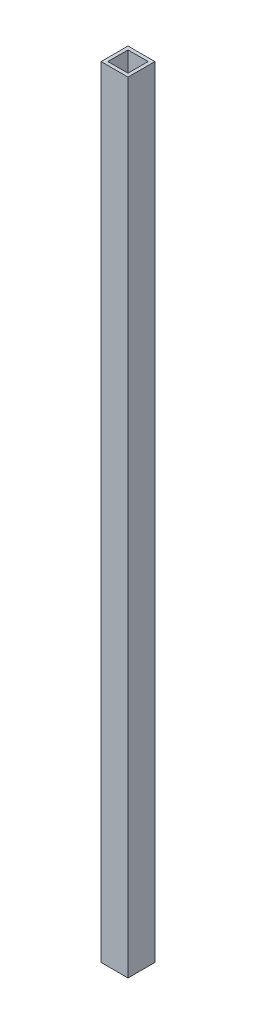
ISO-10303-21;
HEADER;
FILE_DESCRIPTION(('STEP AP214'),'2;1');
FILE_NAME('part.step','',(''),(''),'','','');
FILE_SCHEMA(('AUTOMOTIVE_DESIGN { 1 0 10303 214 1 1 1 1 }'));
ENDSEC;
DATA;
#1=APPLICATION_CONTEXT('core data for automotive mechanical design processes');
#2=APPLICATION_PROTOCOL_DEFINITION('international standard','automotive_design',2000,#1);
#3=PRODUCT_CONTEXT('',#1,'mechanical');
#4=PRODUCT('Part','Part','',(#3));
#5=PRODUCT_RELATED_PRODUCT_CATEGORY('part','',(#4));
#6=PRODUCT_DEFINITION_FORMATION('','',#4);
#7=PRODUCT_DEFINITION_CONTEXT('part definition',#1,'design');
#8=PRODUCT_DEFINITION('design','',#6,#7);
#9=PRODUCT_DEFINITION_SHAPE('','',#8);
#10=(LENGTH_UNIT() NAMED_UNIT(*) SI_UNIT(.MILLI.,.METRE.));
#11=(NAMED_UNIT(*) PLANE_ANGLE_UNIT() SI_UNIT($,.RADIAN.));
#12=(NAMED_UNIT(*) SI_UNIT($,.STERADIAN.) SOLID_ANGLE_UNIT());
#13=UNCERTAINTY_MEASURE_WITH_UNIT(LENGTH_MEASURE(1.E-05),#10,'distance_accuracy_value','');
#14=(GEOMETRIC_REPRESENTATION_CONTEXT(3) GLOBAL_UNCERTAINTY_ASSIGNED_CONTEXT((#13)) GLOBAL_UNIT_ASSIGNED_CONTEXT((#10,
#11,#12)) REPRESENTATION_CONTEXT('',''));
#15=CARTESIAN_POINT('',(0.,0.,0.));
#16=DIRECTION('',(0.,0.,1.));
#17=DIRECTION('',(1.,0.,0.));
#18=AXIS2_PLACEMENT_3D('',#15,#16,#17);
#19=CARTESIAN_POINT('',(0.,736.6,0.));
#20=DIRECTION('',(0.,-1.,0.));
#21=DIRECTION('',(0.,0.,-1.));
#22=AXIS2_PLACEMENT_3D('',#19,#20,#21);
#23=PLANE('',#22);
#24=DIRECTION('',(0.,0.,1.));
#25=VECTOR('',#24,1.);
#26=CARTESIAN_POINT('',(0.,736.6,0.));
#27=LINE('',#26,#25);
#28=CARTESIAN_POINT('',(0.,736.6,-25.4));
#29=VERTEX_POINT('',#28);
#30=CARTESIAN_POINT('',(0.,736.6,0.));
#31=VERTEX_POINT('',#30);
#32=EDGE_CURVE('E134',#29,#31,#27,.T.);
#33=ORIENTED_EDGE('',*,*,#32,.T.);
#34=DIRECTION('',(1.,0.,0.));
#35=VECTOR('',#34,1.);
#36=CARTESIAN_POINT('',(0.,736.6,0.));
#37=LINE('',#36,#35);
#38=CARTESIAN_POINT('',(25.4,736.6,0.));
#39=VERTEX_POINT('',#38);
#40=EDGE_CURVE('E137',#31,#39,#37,.T.);
#41=ORIENTED_EDGE('',*,*,#40,.T.);
#42=DIRECTION('',(0.,0.,-1.));
#43=VECTOR('',#42,1.);
#44=CARTESIAN_POINT('',(25.4,736.6,0.));
#45=LINE('',#44,#43);
#46=CARTESIAN_POINT('',(25.4,736.6,-25.4));
#47=VERTEX_POINT('',#46);
#48=EDGE_CURVE('E140',#39,#47,#45,.T.);
#49=ORIENTED_EDGE('',*,*,#48,.T.);
#50=DIRECTION('',(-1.,0.,0.));
#51=VECTOR('',#50,1.);
#52=CARTESIAN_POINT('',(0.,736.6,-25.4));
#53=LINE('',#52,#51);
#54=EDGE_CURVE('E142',#47,#29,#53,.T.);
#55=ORIENTED_EDGE('',*,*,#54,.T.);
#56=EDGE_LOOP('',(#33,#41,#49,#55));
#57=FACE_BOUND('',#56,.T.);
#58=DIRECTION('',(0.,0.,1.));
#59=VECTOR('',#58,1.);
#60=CARTESIAN_POINT('',(3.175,736.6,-3.175));
#61=LINE('',#60,#59);
#62=CARTESIAN_POINT('',(3.175,736.6,-22.225));
#63=VERTEX_POINT('',#62);
#64=CARTESIAN_POINT('',(3.175,736.6,-3.175));
#65=VERTEX_POINT('',#64);
#66=EDGE_CURVE('E98',#63,#65,#61,.T.);
#67=ORIENTED_EDGE('',*,*,#66,.F.);
#68=DIRECTION('',(-1.,0.,0.));
#69=VECTOR('',#68,1.);
#70=CARTESIAN_POINT('',(3.175,736.6,-22.225));
#71=LINE('',#70,#69);
#72=CARTESIAN_POINT('',(22.225,736.6,-22.225));
#73=VERTEX_POINT('',#72);
#74=EDGE_CURVE('E120',#73,#63,#71,.T.);
#75=ORIENTED_EDGE('',*,*,#74,.F.);
#76=DIRECTION('',(0.,0.,-1.));
#77=VECTOR('',#76,1.);
#78=CARTESIAN_POINT('',(22.225,736.6,-3.175));
#79=LINE('',#78,#77);
#80=CARTESIAN_POINT('',(22.225,736.6,-3.175));
#81=VERTEX_POINT('',#80);
#82=EDGE_CURVE('E118',#81,#73,#79,.T.);
#83=ORIENTED_EDGE('',*,*,#82,.F.);
#84=DIRECTION('',(1.,0.,0.));
#85=VECTOR('',#84,1.);
#86=CARTESIAN_POINT('',(3.175,736.6,-3.175));
#87=LINE('',#86,#85);
#88=EDGE_CURVE('E106',#65,#81,#87,.T.);
#89=ORIENTED_EDGE('',*,*,#88,.F.);
#90=EDGE_LOOP('',(#67,#75,#83,#89));
#91=FACE_BOUND('',#90,.T.);
#92=ADVANCED_FACE('F33',(#57,#91),#23,.F.);
#93=CARTESIAN_POINT('',(0.,0.,0.));
#94=DIRECTION('',(0.,-1.,0.));
#95=DIRECTION('',(0.,0.,-1.));
#96=AXIS2_PLACEMENT_3D('',#93,#94,#95);
#97=PLANE('',#96);
#98=DIRECTION('',(0.,0.,1.));
#99=VECTOR('',#98,1.);
#100=CARTESIAN_POINT('',(0.,0.,0.));
#101=LINE('',#100,#99);
#102=CARTESIAN_POINT('',(0.,0.,-25.4));
#103=VERTEX_POINT('',#102);
#104=CARTESIAN_POINT('',(0.,0.,0.));
#105=VERTEX_POINT('',#104);
#106=EDGE_CURVE('E114',#103,#105,#101,.T.);
#107=ORIENTED_EDGE('',*,*,#106,.F.);
#108=DIRECTION('',(-1.,0.,0.));
#109=VECTOR('',#108,1.);
#110=CARTESIAN_POINT('',(0.,0.,-25.4));
#111=LINE('',#110,#109);
#112=CARTESIAN_POINT('',(25.4,0.,-25.4));
#113=VERTEX_POINT('',#112);
#114=EDGE_CURVE('E138',#113,#103,#111,.T.);
#115=ORIENTED_EDGE('',*,*,#114,.F.);
#116=DIRECTION('',(0.,0.,-1.));
#117=VECTOR('',#116,1.);
#118=CARTESIAN_POINT('',(25.4,0.,0.));
#119=LINE('',#118,#117);
#120=CARTESIAN_POINT('',(25.4,0.,0.));
#121=VERTEX_POINT('',#120);
#122=EDGE_CURVE('E149',#121,#113,#119,.T.);
#123=ORIENTED_EDGE('',*,*,#122,.F.);
#124=DIRECTION('',(1.,0.,0.));
#125=VECTOR('',#124,1.);
#126=CARTESIAN_POINT('',(0.,0.,0.));
#127=LINE('',#126,#125);
#128=EDGE_CURVE('E147',#105,#121,#127,.T.);
#129=ORIENTED_EDGE('',*,*,#128,.F.);
#130=EDGE_LOOP('',(#107,#115,#123,#129));
#131=FACE_BOUND('',#130,.T.);
#132=DIRECTION('',(-1.,0.,0.));
#133=VECTOR('',#132,1.);
#134=CARTESIAN_POINT('',(3.175,0.,-22.225));
#135=LINE('',#134,#133);
#136=CARTESIAN_POINT('',(22.225,0.,-22.225));
#137=VERTEX_POINT('',#136);
#138=CARTESIAN_POINT('',(3.175,0.,-22.225));
#139=VERTEX_POINT('',#138);
#140=EDGE_CURVE('E107',#137,#139,#135,.T.);
#141=ORIENTED_EDGE('',*,*,#140,.T.);
#142=DIRECTION('',(0.,0.,1.));
#143=VECTOR('',#142,1.);
#144=CARTESIAN_POINT('',(3.175,0.,-3.175));
#145=LINE('',#144,#143);
#146=CARTESIAN_POINT('',(3.175,0.,-3.175));
#147=VERTEX_POINT('',#146);
#148=EDGE_CURVE('E56',#139,#147,#145,.T.);
#149=ORIENTED_EDGE('',*,*,#148,.T.);
#150=DIRECTION('',(1.,0.,0.));
#151=VECTOR('',#150,1.);
#152=CARTESIAN_POINT('',(3.175,0.,-3.175));
#153=LINE('',#152,#151);
#154=CARTESIAN_POINT('',(22.225,0.,-3.175));
#155=VERTEX_POINT('',#154);
#156=EDGE_CURVE('E113',#147,#155,#153,.T.);
#157=ORIENTED_EDGE('',*,*,#156,.T.);
#158=DIRECTION('',(0.,0.,-1.));
#159=VECTOR('',#158,1.);
#160=CARTESIAN_POINT('',(22.225,0.,-3.175));
#161=LINE('',#160,#159);
#162=EDGE_CURVE('E126',#155,#137,#161,.T.);
#163=ORIENTED_EDGE('',*,*,#162,.T.);
#164=EDGE_LOOP('',(#141,#149,#157,#163));
#165=FACE_BOUND('',#164,.T.);
#166=ADVANCED_FACE('F167',(#131,#165),#97,.T.);
#167=CARTESIAN_POINT('',(0.,736.6,0.));
#168=DIRECTION('',(1.,0.,0.));
#169=DIRECTION('',(0.,0.,-1.));
#170=AXIS2_PLACEMENT_3D('',#167,#168,#169);
#171=PLANE('',#170);
#172=ORIENTED_EDGE('',*,*,#106,.T.);
#173=DIRECTION('',(0.,-1.,0.));
#174=VECTOR('',#173,1.);
#175=CARTESIAN_POINT('',(0.,736.6,0.));
#176=LINE('',#175,#174);
#177=EDGE_CURVE('E11',#31,#105,#176,.T.);
#178=ORIENTED_EDGE('',*,*,#177,.F.);
#179=ORIENTED_EDGE('',*,*,#32,.F.);
#180=DIRECTION('',(0.,-1.,0.));
#181=VECTOR('',#180,1.);
#182=CARTESIAN_POINT('',(0.,736.6,-25.4));
#183=LINE('',#182,#181);
#184=EDGE_CURVE('E144',#29,#103,#183,.T.);
#185=ORIENTED_EDGE('',*,*,#184,.T.);
#186=EDGE_LOOP('',(#172,#178,#179,#185));
#187=FACE_BOUND('',#186,.T.);
#188=ADVANCED_FACE('F35',(#187),#171,.F.);
#189=CARTESIAN_POINT('',(0.,736.6,0.));
#190=DIRECTION('',(0.,0.,-1.));
#191=DIRECTION('',(-1.,0.,0.));
#192=AXIS2_PLACEMENT_3D('',#189,#190,#191);
#193=PLANE('',#192);
#194=ORIENTED_EDGE('',*,*,#128,.T.);
#195=DIRECTION('',(0.,-1.,0.));
#196=VECTOR('',#195,1.);
#197=CARTESIAN_POINT('',(25.4,736.6,0.));
#198=LINE('',#197,#196);
#199=EDGE_CURVE('E41',#39,#121,#198,.T.);
#200=ORIENTED_EDGE('',*,*,#199,.F.);
#201=ORIENTED_EDGE('',*,*,#40,.F.);
#202=ORIENTED_EDGE('',*,*,#177,.T.);
#203=EDGE_LOOP('',(#194,#200,#201,#202));
#204=FACE_BOUND('',#203,.T.);
#205=ADVANCED_FACE('F177',(#204),#193,.F.);
#206=CARTESIAN_POINT('',(25.4,736.6,0.));
#207=DIRECTION('',(-1.,0.,0.));
#208=DIRECTION('',(0.,0.,1.));
#209=AXIS2_PLACEMENT_3D('',#206,#207,#208);
#210=PLANE('',#209);
#211=ORIENTED_EDGE('',*,*,#122,.T.);
#212=DIRECTION('',(0.,-1.,0.));
#213=VECTOR('',#212,1.);
#214=CARTESIAN_POINT('',(25.4,736.6,-25.4));
#215=LINE('',#214,#213);
#216=EDGE_CURVE('E154',#47,#113,#215,.T.);
#217=ORIENTED_EDGE('',*,*,#216,.F.);
#218=ORIENTED_EDGE('',*,*,#48,.F.);
#219=ORIENTED_EDGE('',*,*,#199,.T.);
#220=EDGE_LOOP('',(#211,#217,#218,#219));
#221=FACE_BOUND('',#220,.T.);
#222=ADVANCED_FACE('F161',(#221),#210,.F.);
#223=CARTESIAN_POINT('',(0.,736.6,-25.4));
#224=DIRECTION('',(0.,0.,1.));
#225=DIRECTION('',(1.,0.,0.));
#226=AXIS2_PLACEMENT_3D('',#223,#224,#225);
#227=PLANE('',#226);
#228=ORIENTED_EDGE('',*,*,#114,.T.);
#229=ORIENTED_EDGE('',*,*,#184,.F.);
#230=ORIENTED_EDGE('',*,*,#54,.F.);
#231=ORIENTED_EDGE('',*,*,#216,.T.);
#232=EDGE_LOOP('',(#228,#229,#230,#231));
#233=FACE_BOUND('',#232,.T.);
#234=ADVANCED_FACE('F171',(#233),#227,.F.);
#235=CARTESIAN_POINT('',(3.175,736.6,-3.175));
#236=DIRECTION('',(1.,0.,0.));
#237=DIRECTION('',(0.,0.,-1.));
#238=AXIS2_PLACEMENT_3D('',#235,#236,#237);
#239=PLANE('',#238);
#240=ORIENTED_EDGE('',*,*,#148,.F.);
#241=DIRECTION('',(0.,-1.,0.));
#242=VECTOR('',#241,1.);
#243=CARTESIAN_POINT('',(3.175,736.6,-22.225));
#244=LINE('',#243,#242);
#245=EDGE_CURVE('E102',#63,#139,#244,.T.);
#246=ORIENTED_EDGE('',*,*,#245,.F.);
#247=ORIENTED_EDGE('',*,*,#66,.T.);
#248=DIRECTION('',(0.,-1.,0.));
#249=VECTOR('',#248,1.);
#250=CARTESIAN_POINT('',(3.175,736.6,-3.175));
#251=LINE('',#250,#249);
#252=EDGE_CURVE('E101',#65,#147,#251,.T.);
#253=ORIENTED_EDGE('',*,*,#252,.T.);
#254=EDGE_LOOP('',(#240,#246,#247,#253));
#255=FACE_BOUND('',#254,.T.);
#256=ADVANCED_FACE('F100',(#255),#239,.T.);
#257=CARTESIAN_POINT('',(3.175,736.6,-3.175));
#258=DIRECTION('',(0.,0.,-1.));
#259=DIRECTION('',(-1.,0.,0.));
#260=AXIS2_PLACEMENT_3D('',#257,#258,#259);
#261=PLANE('',#260);
#262=ORIENTED_EDGE('',*,*,#156,.F.);
#263=ORIENTED_EDGE('',*,*,#252,.F.);
#264=ORIENTED_EDGE('',*,*,#88,.T.);
#265=DIRECTION('',(0.,-1.,0.));
#266=VECTOR('',#265,1.);
#267=CARTESIAN_POINT('',(22.225,736.6,-3.175));
#268=LINE('',#267,#266);
#269=EDGE_CURVE('E115',#81,#155,#268,.T.);
#270=ORIENTED_EDGE('',*,*,#269,.T.);
#271=EDGE_LOOP('',(#262,#263,#264,#270));
#272=FACE_BOUND('',#271,.T.);
#273=ADVANCED_FACE('F110',(#272),#261,.T.);
#274=CARTESIAN_POINT('',(22.225,736.6,-3.175));
#275=DIRECTION('',(-1.,0.,0.));
#276=DIRECTION('',(0.,0.,1.));
#277=AXIS2_PLACEMENT_3D('',#274,#275,#276);
#278=PLANE('',#277);
#279=ORIENTED_EDGE('',*,*,#162,.F.);
#280=ORIENTED_EDGE('',*,*,#269,.F.);
#281=ORIENTED_EDGE('',*,*,#82,.T.);
#282=DIRECTION('',(0.,-1.,0.));
#283=VECTOR('',#282,1.);
#284=CARTESIAN_POINT('',(22.225,736.6,-22.225));
#285=LINE('',#284,#283);
#286=EDGE_CURVE('E48',#73,#137,#285,.T.);
#287=ORIENTED_EDGE('',*,*,#286,.T.);
#288=EDGE_LOOP('',(#279,#280,#281,#287));
#289=FACE_BOUND('',#288,.T.);
#290=ADVANCED_FACE('F200',(#289),#278,.T.);
#291=CARTESIAN_POINT('',(3.175,736.6,-22.225));
#292=DIRECTION('',(0.,0.,1.));
#293=DIRECTION('',(1.,0.,0.));
#294=AXIS2_PLACEMENT_3D('',#291,#292,#293);
#295=PLANE('',#294);
#296=ORIENTED_EDGE('',*,*,#140,.F.);
#297=ORIENTED_EDGE('',*,*,#286,.F.);
#298=ORIENTED_EDGE('',*,*,#74,.T.);
#299=ORIENTED_EDGE('',*,*,#245,.T.);
#300=EDGE_LOOP('',(#296,#297,#298,#299));
#301=FACE_BOUND('',#300,.T.);
#302=ADVANCED_FACE('F204',(#301),#295,.T.);
#303=CLOSED_SHELL('',(#92,#166,#188,#205,#222,#234,#256,#273,#290,#302));
#304=MANIFOLD_SOLID_BREP('B2',#303);
#305=ADVANCED_BREP_SHAPE_REPRESENTATION('',(#18,#304),#14);
#306=SHAPE_DEFINITION_REPRESENTATION(#9,#305);
ENDSEC;
END-ISO-10303-21;
